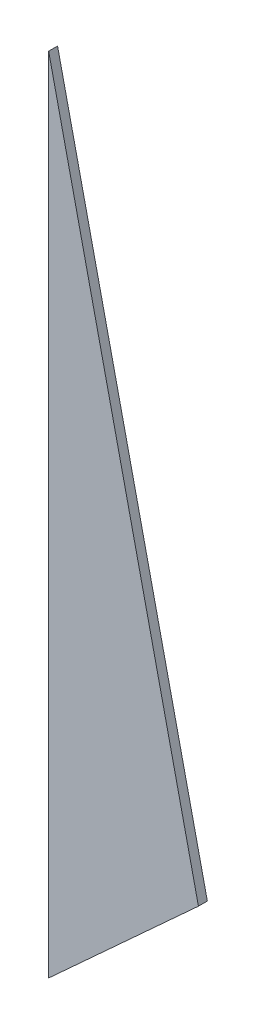
ISO-10303-21;
HEADER;
FILE_DESCRIPTION(('STEP AP214'),'2;1');
FILE_NAME('part.step','',(''),(''),'','','');
FILE_SCHEMA(('AUTOMOTIVE_DESIGN { 1 0 10303 214 1 1 1 1 }'));
ENDSEC;
DATA;
#1=APPLICATION_CONTEXT('core data for automotive mechanical design processes');
#2=APPLICATION_PROTOCOL_DEFINITION('international standard','automotive_design',2000,#1);
#3=PRODUCT_CONTEXT('',#1,'mechanical');
#4=PRODUCT('Part','Part','',(#3));
#5=PRODUCT_RELATED_PRODUCT_CATEGORY('part','',(#4));
#6=PRODUCT_DEFINITION_FORMATION('','',#4);
#7=PRODUCT_DEFINITION_CONTEXT('part definition',#1,'design');
#8=PRODUCT_DEFINITION('design','',#6,#7);
#9=PRODUCT_DEFINITION_SHAPE('','',#8);
#10=(LENGTH_UNIT() NAMED_UNIT(*) SI_UNIT(.MILLI.,.METRE.));
#11=(NAMED_UNIT(*) PLANE_ANGLE_UNIT() SI_UNIT($,.RADIAN.));
#12=(NAMED_UNIT(*) SI_UNIT($,.STERADIAN.) SOLID_ANGLE_UNIT());
#13=UNCERTAINTY_MEASURE_WITH_UNIT(LENGTH_MEASURE(1.E-05),#10,'distance_accuracy_value','');
#14=(GEOMETRIC_REPRESENTATION_CONTEXT(3) GLOBAL_UNCERTAINTY_ASSIGNED_CONTEXT((#13)) GLOBAL_UNIT_ASSIGNED_CONTEXT((#10,
#11,#12)) REPRESENTATION_CONTEXT('',''));
#15=CARTESIAN_POINT('',(0.,0.,0.));
#16=DIRECTION('',(0.,0.,1.));
#17=DIRECTION('',(1.,0.,0.));
#18=AXIS2_PLACEMENT_3D('',#15,#16,#17);
#19=CARTESIAN_POINT('',(0.,45.,0.5));
#20=DIRECTION('',(-0.97560398425353,-0.219537846187479,0.));
#21=DIRECTION('',(0.219537846187479,-0.975603984253531,0.));
#22=AXIS2_PLACEMENT_3D('',#19,#20,#21);
#23=PLANE('',#22);
#24=DIRECTION('',(-0.219537846187479,0.97560398425353,0.));
#25=VECTOR('',#24,1.);
#26=CARTESIAN_POINT('',(0.,45.,-0.5));
#27=LINE('',#26,#25);
#28=CARTESIAN_POINT('',(16.794320409414,-29.6322613107116,-0.5));
#29=VERTEX_POINT('',#28);
#30=CARTESIAN_POINT('',(0.,45.,-0.5));
#31=VERTEX_POINT('',#30);
#32=EDGE_CURVE('E85',#29,#31,#27,.T.);
#33=ORIENTED_EDGE('',*,*,#32,.T.);
#34=DIRECTION('',(0.,0.,-1.));
#35=VECTOR('',#34,1.);
#36=CARTESIAN_POINT('',(0.,45.,0.5));
#37=LINE('',#36,#35);
#38=CARTESIAN_POINT('',(0.,45.,0.5));
#39=VERTEX_POINT('',#38);
#40=EDGE_CURVE('E11',#39,#31,#37,.T.);
#41=ORIENTED_EDGE('',*,*,#40,.F.);
#42=DIRECTION('',(-0.219537846187479,0.97560398425353,0.));
#43=VECTOR('',#42,1.);
#44=CARTESIAN_POINT('',(0.,45.,0.5));
#45=LINE('',#44,#43);
#46=CARTESIAN_POINT('',(16.794320409414,-29.6322613107116,0.5));
#47=VERTEX_POINT('',#46);
#48=EDGE_CURVE('E78',#47,#39,#45,.T.);
#49=ORIENTED_EDGE('',*,*,#48,.F.);
#50=DIRECTION('',(0.,0.,-1.));
#51=VECTOR('',#50,1.);
#52=CARTESIAN_POINT('',(16.794320409414,-29.6322613107116,0.5));
#53=LINE('',#52,#51);
#54=EDGE_CURVE('E86',#47,#29,#53,.T.);
#55=ORIENTED_EDGE('',*,*,#54,.T.);
#56=EDGE_LOOP('',(#33,#41,#49,#55));
#57=FACE_BOUND('',#56,.T.);
#58=ADVANCED_FACE('F38',(#57),#23,.F.);
#59=CARTESIAN_POINT('',(0.,-45.,0.5));
#60=DIRECTION('',(1.,0.,0.));
#61=DIRECTION('',(0.,1.,0.));
#62=AXIS2_PLACEMENT_3D('',#59,#60,#61);
#63=PLANE('',#62);
#64=DIRECTION('',(0.,-1.,0.));
#65=VECTOR('',#64,1.);
#66=CARTESIAN_POINT('',(0.,-45.,-0.5));
#67=LINE('',#66,#65);
#68=CARTESIAN_POINT('',(0.,-45.,-0.5));
#69=VERTEX_POINT('',#68);
#70=EDGE_CURVE('E66',#31,#69,#67,.T.);
#71=ORIENTED_EDGE('',*,*,#70,.T.);
#72=DIRECTION('',(0.,0.,-1.));
#73=VECTOR('',#72,1.);
#74=CARTESIAN_POINT('',(0.,-45.,0.5));
#75=LINE('',#74,#73);
#76=CARTESIAN_POINT('',(0.,-45.,0.5));
#77=VERTEX_POINT('',#76);
#78=EDGE_CURVE('E46',#77,#69,#75,.T.);
#79=ORIENTED_EDGE('',*,*,#78,.F.);
#80=DIRECTION('',(0.,-1.,0.));
#81=VECTOR('',#80,1.);
#82=CARTESIAN_POINT('',(0.,-45.,0.5));
#83=LINE('',#82,#81);
#84=EDGE_CURVE('E74',#39,#77,#83,.T.);
#85=ORIENTED_EDGE('',*,*,#84,.F.);
#86=ORIENTED_EDGE('',*,*,#40,.T.);
#87=EDGE_LOOP('',(#71,#79,#85,#86));
#88=FACE_BOUND('',#87,.T.);
#89=ADVANCED_FACE('F75',(#88),#63,.F.);
#90=CARTESIAN_POINT('',(0.,-45.,0.5));
#91=DIRECTION('',(-0.67507855317929,0.737745855316962,0.));
#92=DIRECTION('',(-0.737745855316962,-0.67507855317929,0.));
#93=AXIS2_PLACEMENT_3D('',#90,#91,#92);
#94=PLANE('',#93);
#95=DIRECTION('',(0.737745855316962,0.67507855317929,0.));
#96=VECTOR('',#95,1.);
#97=CARTESIAN_POINT('',(0.,-45.,-0.5));
#98=LINE('',#97,#96);
#99=EDGE_CURVE('E71',#69,#29,#98,.T.);
#100=ORIENTED_EDGE('',*,*,#99,.T.);
#101=ORIENTED_EDGE('',*,*,#54,.F.);
#102=DIRECTION('',(0.737745855316962,0.67507855317929,0.));
#103=VECTOR('',#102,1.);
#104=CARTESIAN_POINT('',(0.,-45.,0.5));
#105=LINE('',#104,#103);
#106=EDGE_CURVE('E54',#77,#47,#105,.T.);
#107=ORIENTED_EDGE('',*,*,#106,.F.);
#108=ORIENTED_EDGE('',*,*,#78,.T.);
#109=EDGE_LOOP('',(#100,#101,#107,#108));
#110=FACE_BOUND('',#109,.T.);
#111=ADVANCED_FACE('F93',(#110),#94,.F.);
#112=CARTESIAN_POINT('',(0.,0.,0.5));
#113=DIRECTION('',(0.,0.,1.));
#114=DIRECTION('',(1.,0.,0.));
#115=AXIS2_PLACEMENT_3D('',#112,#113,#114);
#116=PLANE('',#115);
#117=ORIENTED_EDGE('',*,*,#48,.T.);
#118=ORIENTED_EDGE('',*,*,#84,.T.);
#119=ORIENTED_EDGE('',*,*,#106,.T.);
#120=EDGE_LOOP('',(#117,#118,#119));
#121=FACE_BOUND('',#120,.T.);
#122=ADVANCED_FACE('F81',(#121),#116,.T.);
#123=CARTESIAN_POINT('',(0.,0.,-0.5));
#124=DIRECTION('',(0.,0.,1.));
#125=DIRECTION('',(1.,0.,0.));
#126=AXIS2_PLACEMENT_3D('',#123,#124,#125);
#127=PLANE('',#126);
#128=ORIENTED_EDGE('',*,*,#32,.F.);
#129=ORIENTED_EDGE('',*,*,#99,.F.);
#130=ORIENTED_EDGE('',*,*,#70,.F.);
#131=EDGE_LOOP('',(#128,#129,#130));
#132=FACE_BOUND('',#131,.T.);
#133=ADVANCED_FACE('F94',(#132),#127,.F.);
#134=CLOSED_SHELL('',(#58,#89,#111,#122,#133));
#135=MANIFOLD_SOLID_BREP('B2',#134);
#136=ADVANCED_BREP_SHAPE_REPRESENTATION('',(#18,#135),#14);
#137=SHAPE_DEFINITION_REPRESENTATION(#9,#136);
ENDSEC;
END-ISO-10303-21;
